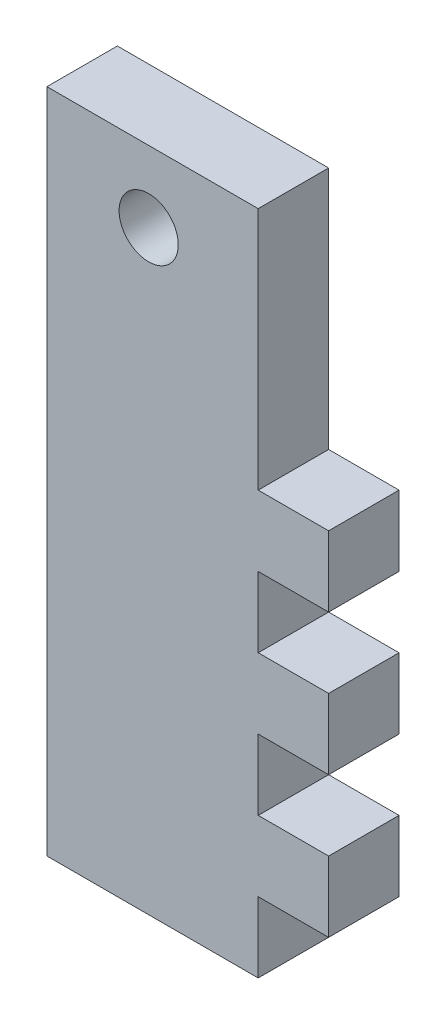
ISO-10303-21;
HEADER;
FILE_DESCRIPTION(('STEP AP214'),'2;1');
FILE_NAME('part.step','',(''),(''),'','','');
FILE_SCHEMA(('AUTOMOTIVE_DESIGN { 1 0 10303 214 1 1 1 1 }'));
ENDSEC;
DATA;
#1=APPLICATION_CONTEXT('core data for automotive mechanical design processes');
#2=APPLICATION_PROTOCOL_DEFINITION('international standard','automotive_design',2000,#1);
#3=PRODUCT_CONTEXT('',#1,'mechanical');
#4=PRODUCT('Part','Part','',(#3));
#5=PRODUCT_RELATED_PRODUCT_CATEGORY('part','',(#4));
#6=PRODUCT_DEFINITION_FORMATION('','',#4);
#7=PRODUCT_DEFINITION_CONTEXT('part definition',#1,'design');
#8=PRODUCT_DEFINITION('design','',#6,#7);
#9=PRODUCT_DEFINITION_SHAPE('','',#8);
#10=(LENGTH_UNIT() NAMED_UNIT(*) SI_UNIT(.MILLI.,.METRE.));
#11=(NAMED_UNIT(*) PLANE_ANGLE_UNIT() SI_UNIT($,.RADIAN.));
#12=(NAMED_UNIT(*) SI_UNIT($,.STERADIAN.) SOLID_ANGLE_UNIT());
#13=UNCERTAINTY_MEASURE_WITH_UNIT(LENGTH_MEASURE(1.E-05),#10,'distance_accuracy_value','');
#14=(GEOMETRIC_REPRESENTATION_CONTEXT(3) GLOBAL_UNCERTAINTY_ASSIGNED_CONTEXT((#13)) GLOBAL_UNIT_ASSIGNED_CONTEXT((#10,
#11,#12)) REPRESENTATION_CONTEXT('',''));
#15=CARTESIAN_POINT('',(0.,0.,0.));
#16=DIRECTION('',(0.,0.,1.));
#17=DIRECTION('',(1.,0.,0.));
#18=AXIS2_PLACEMENT_3D('',#15,#16,#17);
#19=CARTESIAN_POINT('',(0.,0.,5.));
#20=DIRECTION('',(0.,0.,-1.));
#21=DIRECTION('',(-1.,0.,0.));
#22=AXIS2_PLACEMENT_3D('',#19,#20,#21);
#23=PLANE('',#22);
#24=DIRECTION('',(-1.,0.,0.));
#25=VECTOR('',#24,1.);
#26=CARTESIAN_POINT('',(17.5530663566881,2.37355216829719,5.));
#27=LINE('',#26,#25);
#28=CARTESIAN_POINT('',(17.5530663566881,2.37355216829719,5.));
#29=VERTEX_POINT('',#28);
#30=CARTESIAN_POINT('',(12.5530663566881,2.37355216829719,5.));
#31=VERTEX_POINT('',#30);
#32=EDGE_CURVE('E209',#29,#31,#27,.T.);
#33=ORIENTED_EDGE('',*,*,#32,.T.);
#34=DIRECTION('',(0.,1.,0.));
#35=VECTOR('',#34,1.);
#36=CARTESIAN_POINT('',(12.5530663566881,2.37355216829719,5.));
#37=LINE('',#36,#35);
#38=CARTESIAN_POINT('',(12.5530663566881,19.6835521682972,5.));
#39=VERTEX_POINT('',#38);
#40=EDGE_CURVE('E117',#31,#39,#37,.T.);
#41=ORIENTED_EDGE('',*,*,#40,.T.);
#42=DIRECTION('',(-1.,0.,0.));
#43=VECTOR('',#42,1.);
#44=CARTESIAN_POINT('',(12.5530663566881,19.6835521682972,5.));
#45=LINE('',#44,#43);
#46=CARTESIAN_POINT('',(-2.44693364331189,19.6835521682972,5.));
#47=VERTEX_POINT('',#46);
#48=EDGE_CURVE('E248',#39,#47,#45,.T.);
#49=ORIENTED_EDGE('',*,*,#48,.T.);
#50=DIRECTION('',(0.,-1.,0.));
#51=VECTOR('',#50,1.);
#52=CARTESIAN_POINT('',(-2.44693364331189,19.6835521682972,5.));
#53=LINE('',#52,#51);
#54=CARTESIAN_POINT('',(-2.44693364331188,-27.6264478317029,5.));
#55=VERTEX_POINT('',#54);
#56=EDGE_CURVE('E267',#47,#55,#53,.T.);
#57=ORIENTED_EDGE('',*,*,#56,.T.);
#58=DIRECTION('',(1.,0.,0.));
#59=VECTOR('',#58,1.);
#60=CARTESIAN_POINT('',(-2.44693364331188,-27.6264478317029,5.));
#61=LINE('',#60,#59);
#62=CARTESIAN_POINT('',(12.5530663566881,-27.6264478317028,5.));
#63=VERTEX_POINT('',#62);
#64=EDGE_CURVE('E264',#55,#63,#61,.T.);
#65=ORIENTED_EDGE('',*,*,#64,.T.);
#66=DIRECTION('',(0.,1.,0.));
#67=VECTOR('',#66,1.);
#68=CARTESIAN_POINT('',(12.5530663566881,-27.6264478317028,5.));
#69=LINE('',#68,#67);
#70=CARTESIAN_POINT('',(12.5530663566881,-22.6264478317028,5.));
#71=VERTEX_POINT('',#70);
#72=EDGE_CURVE('E266',#63,#71,#69,.T.);
#73=ORIENTED_EDGE('',*,*,#72,.T.);
#74=DIRECTION('',(1.,0.,0.));
#75=VECTOR('',#74,1.);
#76=CARTESIAN_POINT('',(17.5530663566881,-22.6264478317028,5.));
#77=LINE('',#76,#75);
#78=CARTESIAN_POINT('',(17.5530663566881,-22.6264478317028,5.));
#79=VERTEX_POINT('',#78);
#80=EDGE_CURVE('E269',#71,#79,#77,.T.);
#81=ORIENTED_EDGE('',*,*,#80,.T.);
#82=DIRECTION('',(0.,1.,0.));
#83=VECTOR('',#82,1.);
#84=CARTESIAN_POINT('',(17.5530663566881,-22.6264478317028,5.));
#85=LINE('',#84,#83);
#86=CARTESIAN_POINT('',(17.5530663566881,-17.6264478317028,5.));
#87=VERTEX_POINT('',#86);
#88=EDGE_CURVE('E275',#79,#87,#85,.T.);
#89=ORIENTED_EDGE('',*,*,#88,.T.);
#90=DIRECTION('',(-1.,0.,0.));
#91=VECTOR('',#90,1.);
#92=CARTESIAN_POINT('',(17.5530663566881,-17.6264478317028,5.));
#93=LINE('',#92,#91);
#94=CARTESIAN_POINT('',(12.5530663566881,-17.6264478317028,5.));
#95=VERTEX_POINT('',#94);
#96=EDGE_CURVE('E277',#87,#95,#93,.T.);
#97=ORIENTED_EDGE('',*,*,#96,.T.);
#98=DIRECTION('',(0.,1.,0.));
#99=VECTOR('',#98,1.);
#100=CARTESIAN_POINT('',(12.5530663566881,-17.6264478317028,5.));
#101=LINE('',#100,#99);
#102=CARTESIAN_POINT('',(12.5530663566881,-12.6264478317028,5.));
#103=VERTEX_POINT('',#102);
#104=EDGE_CURVE('E279',#95,#103,#101,.T.);
#105=ORIENTED_EDGE('',*,*,#104,.T.);
#106=DIRECTION('',(1.,0.,0.));
#107=VECTOR('',#106,1.);
#108=CARTESIAN_POINT('',(17.5530663566881,-12.6264478317028,5.));
#109=LINE('',#108,#107);
#110=CARTESIAN_POINT('',(17.5530663566881,-12.6264478317028,5.));
#111=VERTEX_POINT('',#110);
#112=EDGE_CURVE('E281',#103,#111,#109,.T.);
#113=ORIENTED_EDGE('',*,*,#112,.T.);
#114=DIRECTION('',(0.,1.,0.));
#115=VECTOR('',#114,1.);
#116=CARTESIAN_POINT('',(17.5530663566881,-12.6264478317028,5.));
#117=LINE('',#116,#115);
#118=CARTESIAN_POINT('',(17.5530663566881,-7.62644783170281,5.));
#119=VERTEX_POINT('',#118);
#120=EDGE_CURVE('E283',#111,#119,#117,.T.);
#121=ORIENTED_EDGE('',*,*,#120,.T.);
#122=DIRECTION('',(-1.,0.,0.));
#123=VECTOR('',#122,1.);
#124=CARTESIAN_POINT('',(17.5530663566881,-7.62644783170281,5.));
#125=LINE('',#124,#123);
#126=CARTESIAN_POINT('',(12.5530663566881,-7.62644783170281,5.));
#127=VERTEX_POINT('',#126);
#128=EDGE_CURVE('E160',#119,#127,#125,.T.);
#129=ORIENTED_EDGE('',*,*,#128,.T.);
#130=DIRECTION('',(0.,1.,0.));
#131=VECTOR('',#130,1.);
#132=CARTESIAN_POINT('',(12.5530663566881,-7.62644783170281,5.));
#133=LINE('',#132,#131);
#134=CARTESIAN_POINT('',(12.5530663566881,-2.62644783170281,5.));
#135=VERTEX_POINT('',#134);
#136=EDGE_CURVE('E154',#127,#135,#133,.T.);
#137=ORIENTED_EDGE('',*,*,#136,.T.);
#138=DIRECTION('',(1.,0.,0.));
#139=VECTOR('',#138,1.);
#140=CARTESIAN_POINT('',(17.5530663566881,-2.62644783170281,5.));
#141=LINE('',#140,#139);
#142=CARTESIAN_POINT('',(17.5530663566881,-2.62644783170281,5.));
#143=VERTEX_POINT('',#142);
#144=EDGE_CURVE('E158',#135,#143,#141,.T.);
#145=ORIENTED_EDGE('',*,*,#144,.T.);
#146=DIRECTION('',(0.,1.,0.));
#147=VECTOR('',#146,1.);
#148=CARTESIAN_POINT('',(17.5530663566881,-2.62644783170281,5.));
#149=LINE('',#148,#147);
#150=EDGE_CURVE('E50',#143,#29,#149,.T.);
#151=ORIENTED_EDGE('',*,*,#150,.T.);
#152=EDGE_LOOP('',(#33,#41,#49,#57,#65,#73,#81,#89,#97,#105,#113,#121,#129,#137,#145,#151));
#153=FACE_BOUND('',#152,.T.);
#154=CARTESIAN_POINT('',(4.77528512211869,14.6207871670683,5.));
#155=DIRECTION('',(0.,0.,1.));
#156=DIRECTION('',(1.,0.,0.));
#157=AXIS2_PLACEMENT_3D('',#154,#155,#156);
#158=CIRCLE('',#157,2.1);
#159=CARTESIAN_POINT('',(6.87528512211869,14.6207871670683,5.));
#160=VERTEX_POINT('',#159);
#161=EDGE_CURVE('E182',#160,#160,#158,.T.);
#162=ORIENTED_EDGE('',*,*,#161,.F.);
#163=EDGE_LOOP('',(#162));
#164=FACE_BOUND('',#163,.T.);
#165=ADVANCED_FACE('F33',(#153,#164),#23,.F.);
#166=CARTESIAN_POINT('',(0.,0.,0.));
#167=DIRECTION('',(0.,0.,-1.));
#168=DIRECTION('',(-1.,0.,0.));
#169=AXIS2_PLACEMENT_3D('',#166,#167,#168);
#170=PLANE('',#169);
#171=DIRECTION('',(-1.,0.,0.));
#172=VECTOR('',#171,1.);
#173=CARTESIAN_POINT('',(17.5530663566881,2.37355216829719,0.));
#174=LINE('',#173,#172);
#175=CARTESIAN_POINT('',(17.5530663566881,2.37355216829719,0.));
#176=VERTEX_POINT('',#175);
#177=CARTESIAN_POINT('',(12.5530663566881,2.37355216829719,0.));
#178=VERTEX_POINT('',#177);
#179=EDGE_CURVE('E178',#176,#178,#174,.T.);
#180=ORIENTED_EDGE('',*,*,#179,.F.);
#181=DIRECTION('',(0.,1.,0.));
#182=VECTOR('',#181,1.);
#183=CARTESIAN_POINT('',(17.5530663566881,-2.62644783170281,0.));
#184=LINE('',#183,#182);
#185=CARTESIAN_POINT('',(17.5530663566881,-2.62644783170281,0.));
#186=VERTEX_POINT('',#185);
#187=EDGE_CURVE('E109',#186,#176,#184,.T.);
#188=ORIENTED_EDGE('',*,*,#187,.F.);
#189=DIRECTION('',(1.,0.,0.));
#190=VECTOR('',#189,1.);
#191=CARTESIAN_POINT('',(17.5530663566881,-2.62644783170281,0.));
#192=LINE('',#191,#190);
#193=CARTESIAN_POINT('',(12.5530663566881,-2.62644783170281,0.));
#194=VERTEX_POINT('',#193);
#195=EDGE_CURVE('E103',#194,#186,#192,.T.);
#196=ORIENTED_EDGE('',*,*,#195,.F.);
#197=DIRECTION('',(0.,1.,0.));
#198=VECTOR('',#197,1.);
#199=CARTESIAN_POINT('',(12.5530663566881,-7.62644783170281,0.));
#200=LINE('',#199,#198);
#201=CARTESIAN_POINT('',(12.5530663566881,-7.62644783170281,0.));
#202=VERTEX_POINT('',#201);
#203=EDGE_CURVE('E168',#202,#194,#200,.T.);
#204=ORIENTED_EDGE('',*,*,#203,.F.);
#205=DIRECTION('',(-1.,0.,0.));
#206=VECTOR('',#205,1.);
#207=CARTESIAN_POINT('',(17.5530663566881,-7.62644783170281,0.));
#208=LINE('',#207,#206);
#209=CARTESIAN_POINT('',(17.5530663566881,-7.62644783170281,0.));
#210=VERTEX_POINT('',#209);
#211=EDGE_CURVE('E204',#210,#202,#208,.T.);
#212=ORIENTED_EDGE('',*,*,#211,.F.);
#213=DIRECTION('',(0.,1.,0.));
#214=VECTOR('',#213,1.);
#215=CARTESIAN_POINT('',(17.5530663566881,-12.6264478317028,0.));
#216=LINE('',#215,#214);
#217=CARTESIAN_POINT('',(17.5530663566881,-12.6264478317028,0.));
#218=VERTEX_POINT('',#217);
#219=EDGE_CURVE('E202',#218,#210,#216,.T.);
#220=ORIENTED_EDGE('',*,*,#219,.F.);
#221=DIRECTION('',(1.,0.,0.));
#222=VECTOR('',#221,1.);
#223=CARTESIAN_POINT('',(17.5530663566881,-12.6264478317028,0.));
#224=LINE('',#223,#222);
#225=CARTESIAN_POINT('',(12.5530663566881,-12.6264478317028,0.));
#226=VERTEX_POINT('',#225);
#227=EDGE_CURVE('E200',#226,#218,#224,.T.);
#228=ORIENTED_EDGE('',*,*,#227,.F.);
#229=DIRECTION('',(0.,1.,0.));
#230=VECTOR('',#229,1.);
#231=CARTESIAN_POINT('',(12.5530663566881,-17.6264478317028,0.));
#232=LINE('',#231,#230);
#233=CARTESIAN_POINT('',(12.5530663566881,-17.6264478317028,0.));
#234=VERTEX_POINT('',#233);
#235=EDGE_CURVE('E198',#234,#226,#232,.T.);
#236=ORIENTED_EDGE('',*,*,#235,.F.);
#237=DIRECTION('',(-1.,0.,0.));
#238=VECTOR('',#237,1.);
#239=CARTESIAN_POINT('',(17.5530663566881,-17.6264478317028,0.));
#240=LINE('',#239,#238);
#241=CARTESIAN_POINT('',(17.5530663566881,-17.6264478317028,0.));
#242=VERTEX_POINT('',#241);
#243=EDGE_CURVE('E196',#242,#234,#240,.T.);
#244=ORIENTED_EDGE('',*,*,#243,.F.);
#245=DIRECTION('',(0.,1.,0.));
#246=VECTOR('',#245,1.);
#247=CARTESIAN_POINT('',(17.5530663566881,-22.6264478317028,0.));
#248=LINE('',#247,#246);
#249=CARTESIAN_POINT('',(17.5530663566881,-22.6264478317028,0.));
#250=VERTEX_POINT('',#249);
#251=EDGE_CURVE('E194',#250,#242,#248,.T.);
#252=ORIENTED_EDGE('',*,*,#251,.F.);
#253=DIRECTION('',(1.,0.,0.));
#254=VECTOR('',#253,1.);
#255=CARTESIAN_POINT('',(17.5530663566881,-22.6264478317028,0.));
#256=LINE('',#255,#254);
#257=CARTESIAN_POINT('',(12.5530663566881,-22.6264478317028,0.));
#258=VERTEX_POINT('',#257);
#259=EDGE_CURVE('E192',#258,#250,#256,.T.);
#260=ORIENTED_EDGE('',*,*,#259,.F.);
#261=DIRECTION('',(0.,1.,0.));
#262=VECTOR('',#261,1.);
#263=CARTESIAN_POINT('',(12.5530663566881,-27.6264478317028,0.));
#264=LINE('',#263,#262);
#265=CARTESIAN_POINT('',(12.5530663566881,-27.6264478317028,0.));
#266=VERTEX_POINT('',#265);
#267=EDGE_CURVE('E190',#266,#258,#264,.T.);
#268=ORIENTED_EDGE('',*,*,#267,.F.);
#269=DIRECTION('',(1.,0.,0.));
#270=VECTOR('',#269,1.);
#271=CARTESIAN_POINT('',(-2.44693364331188,-27.6264478317029,0.));
#272=LINE('',#271,#270);
#273=CARTESIAN_POINT('',(-2.44693364331188,-27.6264478317029,0.));
#274=VERTEX_POINT('',#273);
#275=EDGE_CURVE('E188',#274,#266,#272,.T.);
#276=ORIENTED_EDGE('',*,*,#275,.F.);
#277=DIRECTION('',(0.,-1.,0.));
#278=VECTOR('',#277,1.);
#279=CARTESIAN_POINT('',(-2.44693364331189,19.6835521682972,0.));
#280=LINE('',#279,#278);
#281=CARTESIAN_POINT('',(-2.44693364331189,19.6835521682972,0.));
#282=VERTEX_POINT('',#281);
#283=EDGE_CURVE('E186',#282,#274,#280,.T.);
#284=ORIENTED_EDGE('',*,*,#283,.F.);
#285=DIRECTION('',(-1.,0.,0.));
#286=VECTOR('',#285,1.);
#287=CARTESIAN_POINT('',(12.5530663566881,19.6835521682972,0.));
#288=LINE('',#287,#286);
#289=CARTESIAN_POINT('',(12.5530663566881,19.6835521682972,0.));
#290=VERTEX_POINT('',#289);
#291=EDGE_CURVE('E184',#290,#282,#288,.T.);
#292=ORIENTED_EDGE('',*,*,#291,.F.);
#293=DIRECTION('',(0.,1.,0.));
#294=VECTOR('',#293,1.);
#295=CARTESIAN_POINT('',(12.5530663566882,7.92911019298963,0.));
#296=LINE('',#295,#294);
#297=EDGE_CURVE('E181',#178,#290,#296,.T.);
#298=ORIENTED_EDGE('',*,*,#297,.F.);
#299=EDGE_LOOP('',(#180,#188,#196,#204,#212,#220,#228,#236,#244,#252,#260,#268,#276,#284,#292,#298));
#300=FACE_BOUND('',#299,.T.);
#301=CARTESIAN_POINT('',(4.77528512211869,14.6207871670683,0.));
#302=DIRECTION('',(0.,0.,1.));
#303=DIRECTION('',(1.,0.,0.));
#304=AXIS2_PLACEMENT_3D('',#301,#302,#303);
#305=CIRCLE('',#304,2.1);
#306=CARTESIAN_POINT('',(6.87528512211869,14.6207871670683,0.));
#307=VERTEX_POINT('',#306);
#308=EDGE_CURVE('E485',#307,#307,#305,.T.);
#309=ORIENTED_EDGE('',*,*,#308,.T.);
#310=EDGE_LOOP('',(#309));
#311=FACE_BOUND('',#310,.T.);
#312=ADVANCED_FACE('F252',(#300,#311),#170,.T.);
#313=CARTESIAN_POINT('',(17.5530663566881,2.37355216829719,5.));
#314=DIRECTION('',(0.,-1.,0.));
#315=DIRECTION('',(1.,0.,0.));
#316=AXIS2_PLACEMENT_3D('',#313,#314,#315);
#317=PLANE('',#316);
#318=ORIENTED_EDGE('',*,*,#179,.T.);
#319=DIRECTION('',(0.,0.,-1.));
#320=VECTOR('',#319,1.);
#321=CARTESIAN_POINT('',(12.5530663566881,2.37355216829719,5.));
#322=LINE('',#321,#320);
#323=EDGE_CURVE('E11',#31,#178,#322,.T.);
#324=ORIENTED_EDGE('',*,*,#323,.F.);
#325=ORIENTED_EDGE('',*,*,#32,.F.);
#326=DIRECTION('',(0.,0.,-1.));
#327=VECTOR('',#326,1.);
#328=CARTESIAN_POINT('',(17.5530663566881,2.37355216829719,5.));
#329=LINE('',#328,#327);
#330=EDGE_CURVE('E174',#29,#176,#329,.T.);
#331=ORIENTED_EDGE('',*,*,#330,.T.);
#332=EDGE_LOOP('',(#318,#324,#325,#331));
#333=FACE_BOUND('',#332,.T.);
#334=ADVANCED_FACE('F35',(#333),#317,.F.);
#335=CARTESIAN_POINT('',(12.5530663566882,7.92911019298963,5.));
#336=DIRECTION('',(-1.,0.,0.));
#337=DIRECTION('',(0.,-1.,0.));
#338=AXIS2_PLACEMENT_3D('',#335,#336,#337);
#339=PLANE('',#338);
#340=ORIENTED_EDGE('',*,*,#297,.T.);
#341=DIRECTION('',(0.,0.,-1.));
#342=VECTOR('',#341,1.);
#343=CARTESIAN_POINT('',(12.5530663566881,19.6835521682972,5.));
#344=LINE('',#343,#342);
#345=EDGE_CURVE('E42',#39,#290,#344,.T.);
#346=ORIENTED_EDGE('',*,*,#345,.F.);
#347=ORIENTED_EDGE('',*,*,#40,.F.);
#348=ORIENTED_EDGE('',*,*,#323,.T.);
#349=EDGE_LOOP('',(#340,#346,#347,#348));
#350=FACE_BOUND('',#349,.T.);
#351=ADVANCED_FACE('F317',(#350),#339,.F.);
#352=CARTESIAN_POINT('',(12.5530663566881,19.6835521682972,5.));
#353=DIRECTION('',(0.,-1.,0.));
#354=DIRECTION('',(0.,0.,-1.));
#355=AXIS2_PLACEMENT_3D('',#352,#353,#354);
#356=PLANE('',#355);
#357=ORIENTED_EDGE('',*,*,#291,.T.);
#358=DIRECTION('',(0.,0.,-1.));
#359=VECTOR('',#358,1.);
#360=CARTESIAN_POINT('',(-2.44693364331189,19.6835521682972,5.));
#361=LINE('',#360,#359);
#362=EDGE_CURVE('E240',#47,#282,#361,.T.);
#363=ORIENTED_EDGE('',*,*,#362,.F.);
#364=ORIENTED_EDGE('',*,*,#48,.F.);
#365=ORIENTED_EDGE('',*,*,#345,.T.);
#366=EDGE_LOOP('',(#357,#363,#364,#365));
#367=FACE_BOUND('',#366,.T.);
#368=ADVANCED_FACE('F246',(#367),#356,.F.);
#369=CARTESIAN_POINT('',(-2.44693364331189,19.6835521682972,5.));
#370=DIRECTION('',(1.,0.,0.));
#371=DIRECTION('',(0.,1.,0.));
#372=AXIS2_PLACEMENT_3D('',#369,#370,#371);
#373=PLANE('',#372);
#374=ORIENTED_EDGE('',*,*,#283,.T.);
#375=DIRECTION('',(0.,0.,-1.));
#376=VECTOR('',#375,1.);
#377=CARTESIAN_POINT('',(-2.44693364331188,-27.6264478317029,5.));
#378=LINE('',#377,#376);
#379=EDGE_CURVE('E237',#55,#274,#378,.T.);
#380=ORIENTED_EDGE('',*,*,#379,.F.);
#381=ORIENTED_EDGE('',*,*,#56,.F.);
#382=ORIENTED_EDGE('',*,*,#362,.T.);
#383=EDGE_LOOP('',(#374,#380,#381,#382));
#384=FACE_BOUND('',#383,.T.);
#385=ADVANCED_FACE('F258',(#384),#373,.F.);
#386=CARTESIAN_POINT('',(-2.44693364331188,-27.6264478317029,5.));
#387=DIRECTION('',(0.,1.,0.));
#388=DIRECTION('',(-1.,0.,0.));
#389=AXIS2_PLACEMENT_3D('',#386,#387,#388);
#390=PLANE('',#389);
#391=ORIENTED_EDGE('',*,*,#275,.T.);
#392=DIRECTION('',(0.,0.,-1.));
#393=VECTOR('',#392,1.);
#394=CARTESIAN_POINT('',(12.5530663566881,-27.6264478317028,5.));
#395=LINE('',#394,#393);
#396=EDGE_CURVE('E234',#63,#266,#395,.T.);
#397=ORIENTED_EDGE('',*,*,#396,.F.);
#398=ORIENTED_EDGE('',*,*,#64,.F.);
#399=ORIENTED_EDGE('',*,*,#379,.T.);
#400=EDGE_LOOP('',(#391,#397,#398,#399));
#401=FACE_BOUND('',#400,.T.);
#402=ADVANCED_FACE('F262',(#401),#390,.F.);
#403=CARTESIAN_POINT('',(12.5530663566881,-27.6264478317028,5.));
#404=DIRECTION('',(-1.,0.,0.));
#405=DIRECTION('',(0.,-1.,0.));
#406=AXIS2_PLACEMENT_3D('',#403,#404,#405);
#407=PLANE('',#406);
#408=ORIENTED_EDGE('',*,*,#267,.T.);
#409=DIRECTION('',(0.,0.,-1.));
#410=VECTOR('',#409,1.);
#411=CARTESIAN_POINT('',(12.5530663566881,-22.6264478317028,5.));
#412=LINE('',#411,#410);
#413=EDGE_CURVE('E231',#71,#258,#412,.T.);
#414=ORIENTED_EDGE('',*,*,#413,.F.);
#415=ORIENTED_EDGE('',*,*,#72,.F.);
#416=ORIENTED_EDGE('',*,*,#396,.T.);
#417=EDGE_LOOP('',(#408,#414,#415,#416));
#418=FACE_BOUND('',#417,.T.);
#419=ADVANCED_FACE('F330',(#418),#407,.F.);
#420=CARTESIAN_POINT('',(17.5530663566881,-22.6264478317028,5.));
#421=DIRECTION('',(0.,1.,0.));
#422=DIRECTION('',(-1.,0.,0.));
#423=AXIS2_PLACEMENT_3D('',#420,#421,#422);
#424=PLANE('',#423);
#425=ORIENTED_EDGE('',*,*,#259,.T.);
#426=DIRECTION('',(0.,0.,-1.));
#427=VECTOR('',#426,1.);
#428=CARTESIAN_POINT('',(17.5530663566881,-22.6264478317028,5.));
#429=LINE('',#428,#427);
#430=EDGE_CURVE('E228',#79,#250,#429,.T.);
#431=ORIENTED_EDGE('',*,*,#430,.F.);
#432=ORIENTED_EDGE('',*,*,#80,.F.);
#433=ORIENTED_EDGE('',*,*,#413,.T.);
#434=EDGE_LOOP('',(#425,#431,#432,#433));
#435=FACE_BOUND('',#434,.T.);
#436=ADVANCED_FACE('F333',(#435),#424,.F.);
#437=CARTESIAN_POINT('',(17.5530663566881,-22.6264478317028,5.));
#438=DIRECTION('',(-1.,0.,0.));
#439=DIRECTION('',(0.,-1.,0.));
#440=AXIS2_PLACEMENT_3D('',#437,#438,#439);
#441=PLANE('',#440);
#442=ORIENTED_EDGE('',*,*,#251,.T.);
#443=DIRECTION('',(0.,0.,-1.));
#444=VECTOR('',#443,1.);
#445=CARTESIAN_POINT('',(17.5530663566881,-17.6264478317028,5.));
#446=LINE('',#445,#444);
#447=EDGE_CURVE('E225',#87,#242,#446,.T.);
#448=ORIENTED_EDGE('',*,*,#447,.F.);
#449=ORIENTED_EDGE('',*,*,#88,.F.);
#450=ORIENTED_EDGE('',*,*,#430,.T.);
#451=EDGE_LOOP('',(#442,#448,#449,#450));
#452=FACE_BOUND('',#451,.T.);
#453=ADVANCED_FACE('F337',(#452),#441,.F.);
#454=CARTESIAN_POINT('',(17.5530663566881,-17.6264478317028,5.));
#455=DIRECTION('',(0.,-1.,0.));
#456=DIRECTION('',(1.,0.,0.));
#457=AXIS2_PLACEMENT_3D('',#454,#455,#456);
#458=PLANE('',#457);
#459=ORIENTED_EDGE('',*,*,#243,.T.);
#460=DIRECTION('',(0.,0.,-1.));
#461=VECTOR('',#460,1.);
#462=CARTESIAN_POINT('',(12.5530663566881,-17.6264478317028,5.));
#463=LINE('',#462,#461);
#464=EDGE_CURVE('E222',#95,#234,#463,.T.);
#465=ORIENTED_EDGE('',*,*,#464,.F.);
#466=ORIENTED_EDGE('',*,*,#96,.F.);
#467=ORIENTED_EDGE('',*,*,#447,.T.);
#468=EDGE_LOOP('',(#459,#465,#466,#467));
#469=FACE_BOUND('',#468,.T.);
#470=ADVANCED_FACE('F341',(#469),#458,.F.);
#471=CARTESIAN_POINT('',(12.5530663566881,-17.6264478317028,5.));
#472=DIRECTION('',(-1.,0.,0.));
#473=DIRECTION('',(0.,-1.,0.));
#474=AXIS2_PLACEMENT_3D('',#471,#472,#473);
#475=PLANE('',#474);
#476=ORIENTED_EDGE('',*,*,#235,.T.);
#477=DIRECTION('',(0.,0.,-1.));
#478=VECTOR('',#477,1.);
#479=CARTESIAN_POINT('',(12.5530663566881,-12.6264478317028,5.));
#480=LINE('',#479,#478);
#481=EDGE_CURVE('E219',#103,#226,#480,.T.);
#482=ORIENTED_EDGE('',*,*,#481,.F.);
#483=ORIENTED_EDGE('',*,*,#104,.F.);
#484=ORIENTED_EDGE('',*,*,#464,.T.);
#485=EDGE_LOOP('',(#476,#482,#483,#484));
#486=FACE_BOUND('',#485,.T.);
#487=ADVANCED_FACE('F345',(#486),#475,.F.);
#488=CARTESIAN_POINT('',(17.5530663566881,-12.6264478317028,5.));
#489=DIRECTION('',(0.,1.,0.));
#490=DIRECTION('',(-1.,0.,0.));
#491=AXIS2_PLACEMENT_3D('',#488,#489,#490);
#492=PLANE('',#491);
#493=ORIENTED_EDGE('',*,*,#227,.T.);
#494=DIRECTION('',(0.,0.,-1.));
#495=VECTOR('',#494,1.);
#496=CARTESIAN_POINT('',(17.5530663566881,-12.6264478317028,5.));
#497=LINE('',#496,#495);
#498=EDGE_CURVE('E216',#111,#218,#497,.T.);
#499=ORIENTED_EDGE('',*,*,#498,.F.);
#500=ORIENTED_EDGE('',*,*,#112,.F.);
#501=ORIENTED_EDGE('',*,*,#481,.T.);
#502=EDGE_LOOP('',(#493,#499,#500,#501));
#503=FACE_BOUND('',#502,.T.);
#504=ADVANCED_FACE('F349',(#503),#492,.F.);
#505=CARTESIAN_POINT('',(17.5530663566881,-12.6264478317028,5.));
#506=DIRECTION('',(-1.,0.,0.));
#507=DIRECTION('',(0.,0.,1.));
#508=AXIS2_PLACEMENT_3D('',#505,#506,#507);
#509=PLANE('',#508);
#510=ORIENTED_EDGE('',*,*,#219,.T.);
#511=DIRECTION('',(0.,0.,-1.));
#512=VECTOR('',#511,1.);
#513=CARTESIAN_POINT('',(17.5530663566881,-7.62644783170281,5.));
#514=LINE('',#513,#512);
#515=EDGE_CURVE('E213',#119,#210,#514,.T.);
#516=ORIENTED_EDGE('',*,*,#515,.F.);
#517=ORIENTED_EDGE('',*,*,#120,.F.);
#518=ORIENTED_EDGE('',*,*,#498,.T.);
#519=EDGE_LOOP('',(#510,#516,#517,#518));
#520=FACE_BOUND('',#519,.T.);
#521=ADVANCED_FACE('F289',(#520),#509,.F.);
#522=CARTESIAN_POINT('',(17.5530663566881,-7.62644783170281,5.));
#523=DIRECTION('',(0.,-1.,0.));
#524=DIRECTION('',(1.,0.,0.));
#525=AXIS2_PLACEMENT_3D('',#522,#523,#524);
#526=PLANE('',#525);
#527=ORIENTED_EDGE('',*,*,#211,.T.);
#528=DIRECTION('',(0.,0.,-1.));
#529=VECTOR('',#528,1.);
#530=CARTESIAN_POINT('',(12.5530663566881,-7.62644783170281,5.));
#531=LINE('',#530,#529);
#532=EDGE_CURVE('E169',#127,#202,#531,.T.);
#533=ORIENTED_EDGE('',*,*,#532,.F.);
#534=ORIENTED_EDGE('',*,*,#128,.F.);
#535=ORIENTED_EDGE('',*,*,#515,.T.);
#536=EDGE_LOOP('',(#527,#533,#534,#535));
#537=FACE_BOUND('',#536,.T.);
#538=ADVANCED_FACE('F293',(#537),#526,.F.);
#539=CARTESIAN_POINT('',(12.5530663566881,-7.62644783170281,5.));
#540=DIRECTION('',(-1.,0.,0.));
#541=DIRECTION('',(0.,-1.,0.));
#542=AXIS2_PLACEMENT_3D('',#539,#540,#541);
#543=PLANE('',#542);
#544=ORIENTED_EDGE('',*,*,#203,.T.);
#545=DIRECTION('',(0.,0.,-1.));
#546=VECTOR('',#545,1.);
#547=CARTESIAN_POINT('',(12.5530663566881,-2.62644783170281,5.));
#548=LINE('',#547,#546);
#549=EDGE_CURVE('E165',#135,#194,#548,.T.);
#550=ORIENTED_EDGE('',*,*,#549,.F.);
#551=ORIENTED_EDGE('',*,*,#136,.F.);
#552=ORIENTED_EDGE('',*,*,#532,.T.);
#553=EDGE_LOOP('',(#544,#550,#551,#552));
#554=FACE_BOUND('',#553,.T.);
#555=ADVANCED_FACE('F166',(#554),#543,.F.);
#556=CARTESIAN_POINT('',(17.5530663566881,-2.62644783170281,5.));
#557=DIRECTION('',(0.,1.,0.));
#558=DIRECTION('',(-1.,0.,0.));
#559=AXIS2_PLACEMENT_3D('',#556,#557,#558);
#560=PLANE('',#559);
#561=ORIENTED_EDGE('',*,*,#195,.T.);
#562=DIRECTION('',(0.,0.,-1.));
#563=VECTOR('',#562,1.);
#564=CARTESIAN_POINT('',(17.5530663566881,-2.62644783170281,5.));
#565=LINE('',#564,#563);
#566=EDGE_CURVE('E170',#143,#186,#565,.T.);
#567=ORIENTED_EDGE('',*,*,#566,.F.);
#568=ORIENTED_EDGE('',*,*,#144,.F.);
#569=ORIENTED_EDGE('',*,*,#549,.T.);
#570=EDGE_LOOP('',(#561,#567,#568,#569));
#571=FACE_BOUND('',#570,.T.);
#572=ADVANCED_FACE('F172',(#571),#560,.F.);
#573=CARTESIAN_POINT('',(17.5530663566881,-2.62644783170281,5.));
#574=DIRECTION('',(-1.,0.,0.));
#575=DIRECTION('',(0.,0.,1.));
#576=AXIS2_PLACEMENT_3D('',#573,#574,#575);
#577=PLANE('',#576);
#578=ORIENTED_EDGE('',*,*,#187,.T.);
#579=ORIENTED_EDGE('',*,*,#330,.F.);
#580=ORIENTED_EDGE('',*,*,#150,.F.);
#581=ORIENTED_EDGE('',*,*,#566,.T.);
#582=EDGE_LOOP('',(#578,#579,#580,#581));
#583=FACE_BOUND('',#582,.T.);
#584=ADVANCED_FACE('F297',(#583),#577,.F.);
#585=CARTESIAN_POINT('',(4.77528512211869,14.6207871670683,5.));
#586=DIRECTION('',(0.,0.,-1.));
#587=DIRECTION('',(-1.,0.,0.));
#588=AXIS2_PLACEMENT_3D('',#585,#586,#587);
#589=CYLINDRICAL_SURFACE('',#588,2.1);
#590=ORIENTED_EDGE('',*,*,#161,.T.);
#591=EDGE_LOOP('',(#590));
#592=FACE_BOUND('',#591,.T.);
#593=ORIENTED_EDGE('',*,*,#308,.F.);
#594=EDGE_LOOP('',(#593));
#595=FACE_BOUND('',#594,.T.);
#596=ADVANCED_FACE('F299',(#592,#595),#589,.F.);
#597=CLOSED_SHELL('',(#165,#312,#334,#351,#368,#385,#402,#419,#436,#453,#470,#487,#504,#521,
#538,#555,#572,#584,#596));
#598=MANIFOLD_SOLID_BREP('B2',#597);
#599=ADVANCED_BREP_SHAPE_REPRESENTATION('',(#18,#598),#14);
#600=SHAPE_DEFINITION_REPRESENTATION(#9,#599);
ENDSEC;
END-ISO-10303-21;
